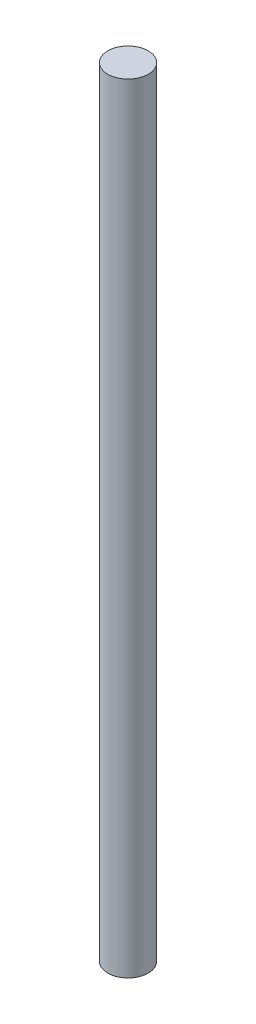
ISO-10303-21;
HEADER;
FILE_DESCRIPTION(('STEP AP214'),'2;1');
FILE_NAME('part.step','',(''),(''),'','','');
FILE_SCHEMA(('AUTOMOTIVE_DESIGN { 1 0 10303 214 1 1 1 1 }'));
ENDSEC;
DATA;
#1=APPLICATION_CONTEXT('core data for automotive mechanical design processes');
#2=APPLICATION_PROTOCOL_DEFINITION('international standard','automotive_design',2000,#1);
#3=PRODUCT_CONTEXT('',#1,'mechanical');
#4=PRODUCT('Part','Part','',(#3));
#5=PRODUCT_RELATED_PRODUCT_CATEGORY('part','',(#4));
#6=PRODUCT_DEFINITION_FORMATION('','',#4);
#7=PRODUCT_DEFINITION_CONTEXT('part definition',#1,'design');
#8=PRODUCT_DEFINITION('design','',#6,#7);
#9=PRODUCT_DEFINITION_SHAPE('','',#8);
#10=(LENGTH_UNIT() NAMED_UNIT(*) SI_UNIT(.MILLI.,.METRE.));
#11=(NAMED_UNIT(*) PLANE_ANGLE_UNIT() SI_UNIT($,.RADIAN.));
#12=(NAMED_UNIT(*) SI_UNIT($,.STERADIAN.) SOLID_ANGLE_UNIT());
#13=UNCERTAINTY_MEASURE_WITH_UNIT(LENGTH_MEASURE(1.E-05),#10,'distance_accuracy_value','');
#14=(GEOMETRIC_REPRESENTATION_CONTEXT(3) GLOBAL_UNCERTAINTY_ASSIGNED_CONTEXT((#13)) GLOBAL_UNIT_ASSIGNED_CONTEXT((#10,
#11,#12)) REPRESENTATION_CONTEXT('',''));
#15=CARTESIAN_POINT('',(0.,0.,0.));
#16=DIRECTION('',(0.,0.,1.));
#17=DIRECTION('',(1.,0.,0.));
#18=AXIS2_PLACEMENT_3D('',#15,#16,#17);
#19=CARTESIAN_POINT('',(0.,609.6,0.));
#20=DIRECTION('',(0.,-1.,0.));
#21=DIRECTION('',(0.,0.,-1.));
#22=AXIS2_PLACEMENT_3D('',#19,#20,#21);
#23=CYLINDRICAL_SURFACE('',#22,15.875);
#24=CARTESIAN_POINT('',(0.,609.6,0.));
#25=DIRECTION('',(0.,1.,0.));
#26=DIRECTION('',(0.,0.,1.));
#27=AXIS2_PLACEMENT_3D('',#24,#25,#26);
#28=CIRCLE('',#27,15.875);
#29=CARTESIAN_POINT('',(0.,609.6,-15.875));
#30=VERTEX_POINT('',#29);
#31=EDGE_CURVE('E10',#30,#30,#28,.T.);
#32=CARTESIAN_POINT('',(0.,0.,0.));
#33=DIRECTION('',(0.,1.,0.));
#34=DIRECTION('',(0.,0.,1.));
#35=AXIS2_PLACEMENT_3D('',#32,#33,#34);
#36=CIRCLE('',#35,15.875);
#37=CARTESIAN_POINT('',(0.,0.,-15.875));
#38=VERTEX_POINT('',#37);
#39=EDGE_CURVE('E40',#38,#38,#36,.T.);
#40=CARTESIAN_POINT('',(0.,609.6,-15.875));
#41=CARTESIAN_POINT('',(0.,603.25,-15.875));
#42=CARTESIAN_POINT('',(0.,596.9,-15.875));
#43=CARTESIAN_POINT('',(0.,584.2,-15.875));
#44=CARTESIAN_POINT('',(0.,577.85,-15.875));
#45=CARTESIAN_POINT('',(0.,565.15,-15.875));
#46=CARTESIAN_POINT('',(0.,558.8,-15.875));
#47=CARTESIAN_POINT('',(0.,546.1,-15.875));
#48=CARTESIAN_POINT('',(0.,539.75,-15.875));
#49=CARTESIAN_POINT('',(0.,527.05,-15.875));
#50=CARTESIAN_POINT('',(0.,520.7,-15.875));
#51=CARTESIAN_POINT('',(0.,508.,-15.875));
#52=CARTESIAN_POINT('',(0.,501.65,-15.875));
#53=CARTESIAN_POINT('',(0.,488.95,-15.875));
#54=CARTESIAN_POINT('',(0.,482.6,-15.875));
#55=CARTESIAN_POINT('',(0.,469.9,-15.875));
#56=CARTESIAN_POINT('',(0.,463.55,-15.875));
#57=CARTESIAN_POINT('',(0.,450.85,-15.875));
#58=CARTESIAN_POINT('',(0.,444.5,-15.875));
#59=CARTESIAN_POINT('',(0.,431.8,-15.875));
#60=CARTESIAN_POINT('',(0.,425.45,-15.875));
#61=CARTESIAN_POINT('',(0.,412.75,-15.875));
#62=CARTESIAN_POINT('',(0.,406.4,-15.875));
#63=CARTESIAN_POINT('',(0.,393.7,-15.875));
#64=CARTESIAN_POINT('',(0.,387.35,-15.875));
#65=CARTESIAN_POINT('',(0.,374.65,-15.875));
#66=CARTESIAN_POINT('',(0.,368.3,-15.875));
#67=CARTESIAN_POINT('',(0.,355.6,-15.875));
#68=CARTESIAN_POINT('',(0.,349.25,-15.875));
#69=CARTESIAN_POINT('',(0.,336.55,-15.875));
#70=CARTESIAN_POINT('',(0.,330.2,-15.875));
#71=CARTESIAN_POINT('',(0.,317.5,-15.875));
#72=CARTESIAN_POINT('',(0.,311.15,-15.875));
#73=CARTESIAN_POINT('',(0.,298.45,-15.875));
#74=CARTESIAN_POINT('',(0.,292.1,-15.875));
#75=CARTESIAN_POINT('',(0.,279.4,-15.875));
#76=CARTESIAN_POINT('',(0.,273.05,-15.875));
#77=CARTESIAN_POINT('',(0.,260.35,-15.875));
#78=CARTESIAN_POINT('',(0.,254.,-15.875));
#79=CARTESIAN_POINT('',(0.,241.3,-15.875));
#80=CARTESIAN_POINT('',(0.,234.95,-15.875));
#81=CARTESIAN_POINT('',(0.,222.25,-15.875));
#82=CARTESIAN_POINT('',(0.,215.9,-15.875));
#83=CARTESIAN_POINT('',(0.,203.2,-15.875));
#84=CARTESIAN_POINT('',(0.,196.85,-15.875));
#85=CARTESIAN_POINT('',(0.,184.15,-15.875));
#86=CARTESIAN_POINT('',(0.,177.8,-15.875));
#87=CARTESIAN_POINT('',(0.,165.1,-15.875));
#88=CARTESIAN_POINT('',(0.,158.75,-15.875));
#89=CARTESIAN_POINT('',(0.,146.05,-15.875));
#90=CARTESIAN_POINT('',(0.,139.7,-15.875));
#91=CARTESIAN_POINT('',(0.,127.,-15.875));
#92=CARTESIAN_POINT('',(0.,120.65,-15.875));
#93=CARTESIAN_POINT('',(0.,107.95,-15.875));
#94=CARTESIAN_POINT('',(0.,101.6,-15.875));
#95=CARTESIAN_POINT('',(0.,88.9,-15.875));
#96=CARTESIAN_POINT('',(0.,82.5500000000001,-15.875));
#97=CARTESIAN_POINT('',(0.,69.85,-15.875));
#98=CARTESIAN_POINT('',(0.,63.5,-15.875));
#99=CARTESIAN_POINT('',(0.,50.8,-15.875));
#100=CARTESIAN_POINT('',(0.,44.45,-15.875));
#101=CARTESIAN_POINT('',(0.,31.75,-15.875));
#102=CARTESIAN_POINT('',(0.,25.4,-15.875));
#103=CARTESIAN_POINT('',(0.,12.7,-15.875));
#104=CARTESIAN_POINT('',(0.,6.35000000000001,-15.875));
#105=CARTESIAN_POINT('',(0.,0.,-15.875));
#106=B_SPLINE_CURVE_WITH_KNOTS('',3,(#40,#41,#42,#43,#44,#45,#46,#47,#48,#49,#50,#51,#52,#53,
#54,#55,#56,#57,#58,#59,#60,#61,#62,#63,#64,#65,#66,#67,#68,#69,#70,#71,#72,#73,#74,#75,#76,#77,
#78,#79,#80,#81,#82,#83,#84,#85,#86,#87,#88,#89,#90,#91,#92,#93,#94,#95,#96,#97,#98,#99,#100,
#101,#102,#103,#104,#105),.UNSPECIFIED.,.F.,.F.,(4,2,2,2,2,2,2,2,2,2,2,2,2,2,2,2,2,2,2,2,2,2,2,
2,2,2,2,2,2,2,2,2,4),(0.,19.05,38.1,57.15,76.2,95.2500000000001,114.3,133.35,152.4,171.45,190.5,
209.55,228.6,247.65,266.7,285.75,304.8,323.85,342.9,361.95,381.,400.05,419.1,438.15,457.2,
476.25,495.3,514.35,533.4,552.45,571.5,590.55,609.6),.UNSPECIFIED.);
#107=EDGE_CURVE('BSEAM37',#30,#38,#106,.T.);
#108=ORIENTED_EDGE('',*,*,#31,.F.);
#109=ORIENTED_EDGE('',*,*,#39,.T.);
#110=ORIENTED_EDGE('',*,*,#107,.T.);
#111=ORIENTED_EDGE('',*,*,#107,.F.);
#112=EDGE_LOOP('',(#108,#110,#109,#111));
#113=FACE_BOUND('',#112,.T.);
#114=ADVANCED_FACE('F37',(#113),#23,.T.);
#115=CARTESIAN_POINT('',(0.,609.6,0.));
#116=DIRECTION('',(0.,1.,0.));
#117=DIRECTION('',(0.,0.,1.));
#118=AXIS2_PLACEMENT_3D('',#115,#116,#117);
#119=PLANE('',#118);
#120=ORIENTED_EDGE('',*,*,#31,.T.);
#121=EDGE_LOOP('',(#120));
#122=FACE_BOUND('',#121,.T.);
#123=ADVANCED_FACE('F96',(#122),#119,.T.);
#124=CARTESIAN_POINT('',(0.,0.,0.));
#125=DIRECTION('',(0.,1.,0.));
#126=DIRECTION('',(0.,0.,1.));
#127=AXIS2_PLACEMENT_3D('',#124,#125,#126);
#128=PLANE('',#127);
#129=CARTESIAN_POINT('',(0.,0.,11.43));
#130=DIRECTION('',(0.,-1.,0.));
#131=DIRECTION('',(0.,0.,-1.));
#132=AXIS2_PLACEMENT_3D('',#129,#130,#131);
#133=CIRCLE('',#132,2.1971);
#134=CARTESIAN_POINT('',(0.,0.,9.2329));
#135=VERTEX_POINT('',#134);
#136=EDGE_CURVE('E75',#135,#135,#133,.T.);
#137=ORIENTED_EDGE('',*,*,#136,.F.);
#138=EDGE_LOOP('',(#137));
#139=FACE_BOUND('',#138,.T.);
#140=CARTESIAN_POINT('',(11.43,0.,0.));
#141=DIRECTION('',(0.,-1.,0.));
#142=DIRECTION('',(0.,0.,-1.));
#143=AXIS2_PLACEMENT_3D('',#140,#141,#142);
#144=CIRCLE('',#143,2.1971);
#145=CARTESIAN_POINT('',(11.43,0.,-2.1971));
#146=VERTEX_POINT('',#145);
#147=EDGE_CURVE('E67',#146,#146,#144,.T.);
#148=ORIENTED_EDGE('',*,*,#147,.F.);
#149=EDGE_LOOP('',(#148));
#150=FACE_BOUND('',#149,.T.);
#151=CARTESIAN_POINT('',(0.,0.,-11.43));
#152=DIRECTION('',(0.,-1.,0.));
#153=DIRECTION('',(0.,0.,-1.));
#154=AXIS2_PLACEMENT_3D('',#151,#152,#153);
#155=CIRCLE('',#154,2.1971);
#156=CARTESIAN_POINT('',(0.,0.,-13.6271));
#157=VERTEX_POINT('',#156);
#158=EDGE_CURVE('E59',#157,#157,#155,.T.);
#159=ORIENTED_EDGE('',*,*,#158,.F.);
#160=EDGE_LOOP('',(#159));
#161=FACE_BOUND('',#160,.T.);
#162=CARTESIAN_POINT('',(-11.43,0.,0.));
#163=DIRECTION('',(0.,-1.,0.));
#164=DIRECTION('',(0.,0.,-1.));
#165=AXIS2_PLACEMENT_3D('',#162,#163,#164);
#166=CIRCLE('',#165,2.1971);
#167=CARTESIAN_POINT('',(-11.43,0.,-2.1971));
#168=VERTEX_POINT('',#167);
#169=EDGE_CURVE('E51',#168,#168,#166,.T.);
#170=ORIENTED_EDGE('',*,*,#169,.F.);
#171=EDGE_LOOP('',(#170));
#172=FACE_BOUND('',#171,.T.);
#173=ORIENTED_EDGE('',*,*,#39,.F.);
#174=EDGE_LOOP('',(#173));
#175=FACE_BOUND('',#174,.T.);
#176=ADVANCED_FACE('F92',(#139,#150,#161,#172,#175),#128,.F.);
#177=CARTESIAN_POINT('',(-11.43,76.2,0.));
#178=DIRECTION('',(0.,-1.,0.));
#179=DIRECTION('',(0.,0.,-1.));
#180=AXIS2_PLACEMENT_3D('',#177,#178,#179);
#181=CYLINDRICAL_SURFACE('',#180,2.1971);
#182=CARTESIAN_POINT('',(-11.43,76.2,0.));
#183=DIRECTION('',(0.,-1.,0.));
#184=DIRECTION('',(0.,0.,-1.));
#185=AXIS2_PLACEMENT_3D('',#182,#183,#184);
#186=CIRCLE('',#185,2.1971);
#187=CARTESIAN_POINT('',(-11.43,76.2,-2.1971));
#188=VERTEX_POINT('',#187);
#189=EDGE_CURVE('E55',#188,#188,#186,.T.);
#190=CARTESIAN_POINT('',(-11.43,76.2,-2.1971));
#191=CARTESIAN_POINT('',(-11.43,75.40625,-2.1971));
#192=CARTESIAN_POINT('',(-11.43,74.6125,-2.1971));
#193=CARTESIAN_POINT('',(-11.43,73.025,-2.1971));
#194=CARTESIAN_POINT('',(-11.43,72.23125,-2.1971));
#195=CARTESIAN_POINT('',(-11.43,70.64375,-2.1971));
#196=CARTESIAN_POINT('',(-11.43,69.85,-2.1971));
#197=CARTESIAN_POINT('',(-11.43,68.2625,-2.1971));
#198=CARTESIAN_POINT('',(-11.43,67.46875,-2.1971));
#199=CARTESIAN_POINT('',(-11.43,65.88125,-2.1971));
#200=CARTESIAN_POINT('',(-11.43,65.0875,-2.1971));
#201=CARTESIAN_POINT('',(-11.43,63.5,-2.1971));
#202=CARTESIAN_POINT('',(-11.43,62.70625,-2.1971));
#203=CARTESIAN_POINT('',(-11.43,61.11875,-2.1971));
#204=CARTESIAN_POINT('',(-11.43,60.325,-2.1971));
#205=CARTESIAN_POINT('',(-11.43,58.7375,-2.1971));
#206=CARTESIAN_POINT('',(-11.43,57.94375,-2.1971));
#207=CARTESIAN_POINT('',(-11.43,56.35625,-2.1971));
#208=CARTESIAN_POINT('',(-11.43,55.5625,-2.1971));
#209=CARTESIAN_POINT('',(-11.43,53.975,-2.1971));
#210=CARTESIAN_POINT('',(-11.43,53.18125,-2.1971));
#211=CARTESIAN_POINT('',(-11.43,51.59375,-2.1971));
#212=CARTESIAN_POINT('',(-11.43,50.8,-2.1971));
#213=CARTESIAN_POINT('',(-11.43,49.2125,-2.1971));
#214=CARTESIAN_POINT('',(-11.43,48.41875,-2.1971));
#215=CARTESIAN_POINT('',(-11.43,46.83125,-2.1971));
#216=CARTESIAN_POINT('',(-11.43,46.0375,-2.1971));
#217=CARTESIAN_POINT('',(-11.43,44.45,-2.1971));
#218=CARTESIAN_POINT('',(-11.43,43.65625,-2.1971));
#219=CARTESIAN_POINT('',(-11.43,42.06875,-2.1971));
#220=CARTESIAN_POINT('',(-11.43,41.275,-2.1971));
#221=CARTESIAN_POINT('',(-11.43,39.6875,-2.1971));
#222=CARTESIAN_POINT('',(-11.43,38.89375,-2.1971));
#223=CARTESIAN_POINT('',(-11.43,37.30625,-2.1971));
#224=CARTESIAN_POINT('',(-11.43,36.5125,-2.1971));
#225=CARTESIAN_POINT('',(-11.43,34.925,-2.1971));
#226=CARTESIAN_POINT('',(-11.43,34.13125,-2.1971));
#227=CARTESIAN_POINT('',(-11.43,32.54375,-2.1971));
#228=CARTESIAN_POINT('',(-11.43,31.75,-2.1971));
#229=CARTESIAN_POINT('',(-11.43,30.1625,-2.1971));
#230=CARTESIAN_POINT('',(-11.43,29.36875,-2.1971));
#231=CARTESIAN_POINT('',(-11.43,27.78125,-2.1971));
#232=CARTESIAN_POINT('',(-11.43,26.9875,-2.1971));
#233=CARTESIAN_POINT('',(-11.43,25.4,-2.1971));
#234=CARTESIAN_POINT('',(-11.43,24.60625,-2.1971));
#235=CARTESIAN_POINT('',(-11.43,23.01875,-2.1971));
#236=CARTESIAN_POINT('',(-11.43,22.225,-2.1971));
#237=CARTESIAN_POINT('',(-11.43,20.6375,-2.1971));
#238=CARTESIAN_POINT('',(-11.43,19.84375,-2.1971));
#239=CARTESIAN_POINT('',(-11.43,18.25625,-2.1971));
#240=CARTESIAN_POINT('',(-11.43,17.4625,-2.1971));
#241=CARTESIAN_POINT('',(-11.43,15.875,-2.1971));
#242=CARTESIAN_POINT('',(-11.43,15.08125,-2.1971));
#243=CARTESIAN_POINT('',(-11.43,13.49375,-2.1971));
#244=CARTESIAN_POINT('',(-11.43,12.7,-2.1971));
#245=CARTESIAN_POINT('',(-11.43,11.1125,-2.1971));
#246=CARTESIAN_POINT('',(-11.43,10.31875,-2.1971));
#247=CARTESIAN_POINT('',(-11.43,8.73125,-2.1971));
#248=CARTESIAN_POINT('',(-11.43,7.93750000000001,-2.1971));
#249=CARTESIAN_POINT('',(-11.43,6.35,-2.1971));
#250=CARTESIAN_POINT('',(-11.43,5.55625,-2.1971));
#251=CARTESIAN_POINT('',(-11.43,3.96875,-2.1971));
#252=CARTESIAN_POINT('',(-11.43,3.175,-2.1971));
#253=CARTESIAN_POINT('',(-11.43,1.5875,-2.1971));
#254=CARTESIAN_POINT('',(-11.43,0.793750000000001,-2.1971));
#255=CARTESIAN_POINT('',(-11.43,0.,-2.1971));
#256=B_SPLINE_CURVE_WITH_KNOTS('',3,(#190,#191,#192,#193,#194,#195,#196,#197,#198,#199,#200,
#201,#202,#203,#204,#205,#206,#207,#208,#209,#210,#211,#212,#213,#214,#215,#216,#217,#218,#219,
#220,#221,#222,#223,#224,#225,#226,#227,#228,#229,#230,#231,#232,#233,#234,#235,#236,#237,#238,
#239,#240,#241,#242,#243,#244,#245,#246,#247,#248,#249,#250,#251,#252,#253,#254,#255),
.UNSPECIFIED.,.F.,.F.,(4,2,2,2,2,2,2,2,2,2,2,2,2,2,2,2,2,2,2,2,2,2,2,2,2,2,2,2,2,2,2,2,4),(0.,
2.38125,4.7625,7.14375,9.52500000000001,11.90625,14.2875,16.66875,19.05,21.43125,23.8125,
26.19375,28.575,30.95625,33.3375,35.71875,38.1,40.48125,42.8625,45.24375,47.625,50.00625,
52.3875,54.76875,57.15,59.53125,61.9125,64.29375,66.675,69.05625,71.4375,73.81875,76.2),.UNSPECIFIED.);
#257=EDGE_CURVE('BSEAM95',#188,#168,#256,.T.);
#258=ORIENTED_EDGE('',*,*,#189,.F.);
#259=ORIENTED_EDGE('',*,*,#169,.T.);
#260=ORIENTED_EDGE('',*,*,#257,.T.);
#261=ORIENTED_EDGE('',*,*,#257,.F.);
#262=EDGE_LOOP('',(#258,#260,#259,#261));
#263=FACE_BOUND('',#262,.T.);
#264=ADVANCED_FACE('F95',(#263),#181,.F.);
#265=CARTESIAN_POINT('',(-11.43,76.2,0.));
#266=DIRECTION('',(0.,-1.,0.));
#267=DIRECTION('',(0.,0.,-1.));
#268=AXIS2_PLACEMENT_3D('',#265,#266,#267);
#269=PLANE('',#268);
#270=ORIENTED_EDGE('',*,*,#189,.T.);
#271=EDGE_LOOP('',(#270));
#272=FACE_BOUND('',#271,.T.);
#273=ADVANCED_FACE('F116',(#272),#269,.T.);
#274=CARTESIAN_POINT('',(0.,76.2,-11.43));
#275=DIRECTION('',(0.,-1.,0.));
#276=DIRECTION('',(0.,0.,-1.));
#277=AXIS2_PLACEMENT_3D('',#274,#275,#276);
#278=CYLINDRICAL_SURFACE('',#277,2.1971);
#279=CARTESIAN_POINT('',(0.,76.2,-11.43));
#280=DIRECTION('',(0.,-1.,0.));
#281=DIRECTION('',(0.,0.,-1.));
#282=AXIS2_PLACEMENT_3D('',#279,#280,#281);
#283=CIRCLE('',#282,2.1971);
#284=CARTESIAN_POINT('',(0.,76.2,-13.6271));
#285=VERTEX_POINT('',#284);
#286=EDGE_CURVE('E63',#285,#285,#283,.T.);
#287=CARTESIAN_POINT('',(0.,76.2,-13.6271));
#288=CARTESIAN_POINT('',(0.,75.40625,-13.6271));
#289=CARTESIAN_POINT('',(0.,74.6125,-13.6271));
#290=CARTESIAN_POINT('',(0.,73.025,-13.6271));
#291=CARTESIAN_POINT('',(0.,72.23125,-13.6271));
#292=CARTESIAN_POINT('',(0.,70.64375,-13.6271));
#293=CARTESIAN_POINT('',(0.,69.85,-13.6271));
#294=CARTESIAN_POINT('',(0.,68.2625,-13.6271));
#295=CARTESIAN_POINT('',(0.,67.46875,-13.6271));
#296=CARTESIAN_POINT('',(0.,65.88125,-13.6271));
#297=CARTESIAN_POINT('',(0.,65.0875,-13.6271));
#298=CARTESIAN_POINT('',(0.,63.5,-13.6271));
#299=CARTESIAN_POINT('',(0.,62.70625,-13.6271));
#300=CARTESIAN_POINT('',(0.,61.11875,-13.6271));
#301=CARTESIAN_POINT('',(0.,60.325,-13.6271));
#302=CARTESIAN_POINT('',(0.,58.7375,-13.6271));
#303=CARTESIAN_POINT('',(0.,57.94375,-13.6271));
#304=CARTESIAN_POINT('',(0.,56.35625,-13.6271));
#305=CARTESIAN_POINT('',(0.,55.5625,-13.6271));
#306=CARTESIAN_POINT('',(0.,53.975,-13.6271));
#307=CARTESIAN_POINT('',(0.,53.18125,-13.6271));
#308=CARTESIAN_POINT('',(0.,51.59375,-13.6271));
#309=CARTESIAN_POINT('',(0.,50.8,-13.6271));
#310=CARTESIAN_POINT('',(0.,49.2125,-13.6271));
#311=CARTESIAN_POINT('',(0.,48.41875,-13.6271));
#312=CARTESIAN_POINT('',(0.,46.83125,-13.6271));
#313=CARTESIAN_POINT('',(0.,46.0375,-13.6271));
#314=CARTESIAN_POINT('',(0.,44.45,-13.6271));
#315=CARTESIAN_POINT('',(0.,43.65625,-13.6271));
#316=CARTESIAN_POINT('',(0.,42.06875,-13.6271));
#317=CARTESIAN_POINT('',(0.,41.275,-13.6271));
#318=CARTESIAN_POINT('',(0.,39.6875,-13.6271));
#319=CARTESIAN_POINT('',(0.,38.89375,-13.6271));
#320=CARTESIAN_POINT('',(0.,37.30625,-13.6271));
#321=CARTESIAN_POINT('',(0.,36.5125,-13.6271));
#322=CARTESIAN_POINT('',(0.,34.925,-13.6271));
#323=CARTESIAN_POINT('',(0.,34.13125,-13.6271));
#324=CARTESIAN_POINT('',(0.,32.54375,-13.6271));
#325=CARTESIAN_POINT('',(0.,31.75,-13.6271));
#326=CARTESIAN_POINT('',(0.,30.1625,-13.6271));
#327=CARTESIAN_POINT('',(0.,29.36875,-13.6271));
#328=CARTESIAN_POINT('',(0.,27.78125,-13.6271));
#329=CARTESIAN_POINT('',(0.,26.9875,-13.6271));
#330=CARTESIAN_POINT('',(0.,25.4,-13.6271));
#331=CARTESIAN_POINT('',(0.,24.60625,-13.6271));
#332=CARTESIAN_POINT('',(0.,23.01875,-13.6271));
#333=CARTESIAN_POINT('',(0.,22.225,-13.6271));
#334=CARTESIAN_POINT('',(0.,20.6375,-13.6271));
#335=CARTESIAN_POINT('',(0.,19.84375,-13.6271));
#336=CARTESIAN_POINT('',(0.,18.25625,-13.6271));
#337=CARTESIAN_POINT('',(0.,17.4625,-13.6271));
#338=CARTESIAN_POINT('',(0.,15.875,-13.6271));
#339=CARTESIAN_POINT('',(0.,15.08125,-13.6271));
#340=CARTESIAN_POINT('',(0.,13.49375,-13.6271));
#341=CARTESIAN_POINT('',(0.,12.7,-13.6271));
#342=CARTESIAN_POINT('',(0.,11.1125,-13.6271));
#343=CARTESIAN_POINT('',(0.,10.31875,-13.6271));
#344=CARTESIAN_POINT('',(0.,8.73125,-13.6271));
#345=CARTESIAN_POINT('',(0.,7.93750000000001,-13.6271));
#346=CARTESIAN_POINT('',(0.,6.35,-13.6271));
#347=CARTESIAN_POINT('',(0.,5.55625,-13.6271));
#348=CARTESIAN_POINT('',(0.,3.96875,-13.6271));
#349=CARTESIAN_POINT('',(0.,3.175,-13.6271));
#350=CARTESIAN_POINT('',(0.,1.5875,-13.6271));
#351=CARTESIAN_POINT('',(0.,0.793750000000001,-13.6271));
#352=CARTESIAN_POINT('',(0.,0.,-13.6271));
#353=B_SPLINE_CURVE_WITH_KNOTS('',3,(#287,#288,#289,#290,#291,#292,#293,#294,#295,#296,#297,
#298,#299,#300,#301,#302,#303,#304,#305,#306,#307,#308,#309,#310,#311,#312,#313,#314,#315,#316,
#317,#318,#319,#320,#321,#322,#323,#324,#325,#326,#327,#328,#329,#330,#331,#332,#333,#334,#335,
#336,#337,#338,#339,#340,#341,#342,#343,#344,#345,#346,#347,#348,#349,#350,#351,#352),
.UNSPECIFIED.,.F.,.F.,(4,2,2,2,2,2,2,2,2,2,2,2,2,2,2,2,2,2,2,2,2,2,2,2,2,2,2,2,2,2,2,2,4),(0.,
2.38125,4.7625,7.14375,9.52500000000001,11.90625,14.2875,16.66875,19.05,21.43125,23.8125,
26.19375,28.575,30.95625,33.3375,35.71875,38.1,40.48125,42.8625,45.24375,47.625,50.00625,
52.3875,54.76875,57.15,59.53125,61.9125,64.29375,66.675,69.05625,71.4375,73.81875,76.2),.UNSPECIFIED.);
#354=EDGE_CURVE('BSEAM120',#285,#157,#353,.T.);
#355=ORIENTED_EDGE('',*,*,#286,.F.);
#356=ORIENTED_EDGE('',*,*,#158,.T.);
#357=ORIENTED_EDGE('',*,*,#354,.T.);
#358=ORIENTED_EDGE('',*,*,#354,.F.);
#359=EDGE_LOOP('',(#355,#357,#356,#358));
#360=FACE_BOUND('',#359,.T.);
#361=ADVANCED_FACE('F120',(#360),#278,.F.);
#362=CARTESIAN_POINT('',(0.,76.2,-11.43));
#363=DIRECTION('',(0.,-1.,0.));
#364=DIRECTION('',(0.,0.,-1.));
#365=AXIS2_PLACEMENT_3D('',#362,#363,#364);
#366=PLANE('',#365);
#367=ORIENTED_EDGE('',*,*,#286,.T.);
#368=EDGE_LOOP('',(#367));
#369=FACE_BOUND('',#368,.T.);
#370=ADVANCED_FACE('F124',(#369),#366,.T.);
#371=CARTESIAN_POINT('',(11.43,76.2,0.));
#372=DIRECTION('',(0.,-1.,0.));
#373=DIRECTION('',(0.,0.,-1.));
#374=AXIS2_PLACEMENT_3D('',#371,#372,#373);
#375=CYLINDRICAL_SURFACE('',#374,2.1971);
#376=CARTESIAN_POINT('',(11.43,76.2,0.));
#377=DIRECTION('',(0.,-1.,0.));
#378=DIRECTION('',(0.,0.,-1.));
#379=AXIS2_PLACEMENT_3D('',#376,#377,#378);
#380=CIRCLE('',#379,2.1971);
#381=CARTESIAN_POINT('',(11.43,76.2,-2.1971));
#382=VERTEX_POINT('',#381);
#383=EDGE_CURVE('E71',#382,#382,#380,.T.);
#384=CARTESIAN_POINT('',(11.43,76.2,-2.1971));
#385=CARTESIAN_POINT('',(11.43,75.40625,-2.1971));
#386=CARTESIAN_POINT('',(11.43,74.6125,-2.1971));
#387=CARTESIAN_POINT('',(11.43,73.025,-2.1971));
#388=CARTESIAN_POINT('',(11.43,72.23125,-2.1971));
#389=CARTESIAN_POINT('',(11.43,70.64375,-2.1971));
#390=CARTESIAN_POINT('',(11.43,69.85,-2.1971));
#391=CARTESIAN_POINT('',(11.43,68.2625,-2.1971));
#392=CARTESIAN_POINT('',(11.43,67.46875,-2.1971));
#393=CARTESIAN_POINT('',(11.43,65.88125,-2.1971));
#394=CARTESIAN_POINT('',(11.43,65.0875,-2.1971));
#395=CARTESIAN_POINT('',(11.43,63.5,-2.1971));
#396=CARTESIAN_POINT('',(11.43,62.70625,-2.1971));
#397=CARTESIAN_POINT('',(11.43,61.11875,-2.1971));
#398=CARTESIAN_POINT('',(11.43,60.325,-2.1971));
#399=CARTESIAN_POINT('',(11.43,58.7375,-2.1971));
#400=CARTESIAN_POINT('',(11.43,57.94375,-2.1971));
#401=CARTESIAN_POINT('',(11.43,56.35625,-2.1971));
#402=CARTESIAN_POINT('',(11.43,55.5625,-2.1971));
#403=CARTESIAN_POINT('',(11.43,53.975,-2.1971));
#404=CARTESIAN_POINT('',(11.43,53.18125,-2.1971));
#405=CARTESIAN_POINT('',(11.43,51.59375,-2.1971));
#406=CARTESIAN_POINT('',(11.43,50.8,-2.1971));
#407=CARTESIAN_POINT('',(11.43,49.2125,-2.1971));
#408=CARTESIAN_POINT('',(11.43,48.41875,-2.1971));
#409=CARTESIAN_POINT('',(11.43,46.83125,-2.1971));
#410=CARTESIAN_POINT('',(11.43,46.0375,-2.1971));
#411=CARTESIAN_POINT('',(11.43,44.45,-2.1971));
#412=CARTESIAN_POINT('',(11.43,43.65625,-2.1971));
#413=CARTESIAN_POINT('',(11.43,42.06875,-2.1971));
#414=CARTESIAN_POINT('',(11.43,41.275,-2.1971));
#415=CARTESIAN_POINT('',(11.43,39.6875,-2.1971));
#416=CARTESIAN_POINT('',(11.43,38.89375,-2.1971));
#417=CARTESIAN_POINT('',(11.43,37.30625,-2.1971));
#418=CARTESIAN_POINT('',(11.43,36.5125,-2.1971));
#419=CARTESIAN_POINT('',(11.43,34.925,-2.1971));
#420=CARTESIAN_POINT('',(11.43,34.13125,-2.1971));
#421=CARTESIAN_POINT('',(11.43,32.54375,-2.1971));
#422=CARTESIAN_POINT('',(11.43,31.75,-2.1971));
#423=CARTESIAN_POINT('',(11.43,30.1625,-2.1971));
#424=CARTESIAN_POINT('',(11.43,29.36875,-2.1971));
#425=CARTESIAN_POINT('',(11.43,27.78125,-2.1971));
#426=CARTESIAN_POINT('',(11.43,26.9875,-2.1971));
#427=CARTESIAN_POINT('',(11.43,25.4,-2.1971));
#428=CARTESIAN_POINT('',(11.43,24.60625,-2.1971));
#429=CARTESIAN_POINT('',(11.43,23.01875,-2.1971));
#430=CARTESIAN_POINT('',(11.43,22.225,-2.1971));
#431=CARTESIAN_POINT('',(11.43,20.6375,-2.1971));
#432=CARTESIAN_POINT('',(11.43,19.84375,-2.1971));
#433=CARTESIAN_POINT('',(11.43,18.25625,-2.1971));
#434=CARTESIAN_POINT('',(11.43,17.4625,-2.1971));
#435=CARTESIAN_POINT('',(11.43,15.875,-2.1971));
#436=CARTESIAN_POINT('',(11.43,15.08125,-2.1971));
#437=CARTESIAN_POINT('',(11.43,13.49375,-2.1971));
#438=CARTESIAN_POINT('',(11.43,12.7,-2.1971));
#439=CARTESIAN_POINT('',(11.43,11.1125,-2.1971));
#440=CARTESIAN_POINT('',(11.43,10.31875,-2.1971));
#441=CARTESIAN_POINT('',(11.43,8.73125,-2.1971));
#442=CARTESIAN_POINT('',(11.43,7.93750000000001,-2.1971));
#443=CARTESIAN_POINT('',(11.43,6.35,-2.1971));
#444=CARTESIAN_POINT('',(11.43,5.55625,-2.1971));
#445=CARTESIAN_POINT('',(11.43,3.96875,-2.1971));
#446=CARTESIAN_POINT('',(11.43,3.175,-2.1971));
#447=CARTESIAN_POINT('',(11.43,1.5875,-2.1971));
#448=CARTESIAN_POINT('',(11.43,0.793750000000001,-2.1971));
#449=CARTESIAN_POINT('',(11.43,0.,-2.1971));
#450=B_SPLINE_CURVE_WITH_KNOTS('',3,(#384,#385,#386,#387,#388,#389,#390,#391,#392,#393,#394,
#395,#396,#397,#398,#399,#400,#401,#402,#403,#404,#405,#406,#407,#408,#409,#410,#411,#412,#413,
#414,#415,#416,#417,#418,#419,#420,#421,#422,#423,#424,#425,#426,#427,#428,#429,#430,#431,#432,
#433,#434,#435,#436,#437,#438,#439,#440,#441,#442,#443,#444,#445,#446,#447,#448,#449),
.UNSPECIFIED.,.F.,.F.,(4,2,2,2,2,2,2,2,2,2,2,2,2,2,2,2,2,2,2,2,2,2,2,2,2,2,2,2,2,2,2,2,4),(0.,
2.38125,4.7625,7.14375,9.52500000000001,11.90625,14.2875,16.66875,19.05,21.43125,23.8125,
26.19375,28.575,30.95625,33.3375,35.71875,38.1,40.48125,42.8625,45.24375,47.625,50.00625,
52.3875,54.76875,57.15,59.53125,61.9125,64.29375,66.675,69.05625,71.4375,73.81875,76.2),.UNSPECIFIED.);
#451=EDGE_CURVE('BSEAM128',#382,#146,#450,.T.);
#452=ORIENTED_EDGE('',*,*,#383,.F.);
#453=ORIENTED_EDGE('',*,*,#147,.T.);
#454=ORIENTED_EDGE('',*,*,#451,.T.);
#455=ORIENTED_EDGE('',*,*,#451,.F.);
#456=EDGE_LOOP('',(#452,#454,#453,#455));
#457=FACE_BOUND('',#456,.T.);
#458=ADVANCED_FACE('F128',(#457),#375,.F.);
#459=CARTESIAN_POINT('',(11.43,76.2,0.));
#460=DIRECTION('',(0.,-1.,0.));
#461=DIRECTION('',(0.,0.,-1.));
#462=AXIS2_PLACEMENT_3D('',#459,#460,#461);
#463=PLANE('',#462);
#464=ORIENTED_EDGE('',*,*,#383,.T.);
#465=EDGE_LOOP('',(#464));
#466=FACE_BOUND('',#465,.T.);
#467=ADVANCED_FACE('F88',(#466),#463,.T.);
#468=CARTESIAN_POINT('',(0.,76.2,11.43));
#469=DIRECTION('',(0.,-1.,0.));
#470=DIRECTION('',(0.,0.,-1.));
#471=AXIS2_PLACEMENT_3D('',#468,#469,#470);
#472=CYLINDRICAL_SURFACE('',#471,2.1971);
#473=CARTESIAN_POINT('',(0.,76.2,11.43));
#474=DIRECTION('',(0.,-1.,0.));
#475=DIRECTION('',(0.,0.,-1.));
#476=AXIS2_PLACEMENT_3D('',#473,#474,#475);
#477=CIRCLE('',#476,2.1971);
#478=CARTESIAN_POINT('',(0.,76.2,9.2329));
#479=VERTEX_POINT('',#478);
#480=EDGE_CURVE('E49',#479,#479,#477,.T.);
#481=CARTESIAN_POINT('',(0.,76.2,9.2329));
#482=CARTESIAN_POINT('',(0.,75.40625,9.2329));
#483=CARTESIAN_POINT('',(0.,74.6125,9.2329));
#484=CARTESIAN_POINT('',(0.,73.025,9.2329));
#485=CARTESIAN_POINT('',(0.,72.23125,9.2329));
#486=CARTESIAN_POINT('',(0.,70.64375,9.2329));
#487=CARTESIAN_POINT('',(0.,69.85,9.2329));
#488=CARTESIAN_POINT('',(0.,68.2625,9.2329));
#489=CARTESIAN_POINT('',(0.,67.46875,9.2329));
#490=CARTESIAN_POINT('',(0.,65.88125,9.2329));
#491=CARTESIAN_POINT('',(0.,65.0875,9.2329));
#492=CARTESIAN_POINT('',(0.,63.5,9.2329));
#493=CARTESIAN_POINT('',(0.,62.70625,9.2329));
#494=CARTESIAN_POINT('',(0.,61.11875,9.2329));
#495=CARTESIAN_POINT('',(0.,60.325,9.2329));
#496=CARTESIAN_POINT('',(0.,58.7375,9.2329));
#497=CARTESIAN_POINT('',(0.,57.94375,9.2329));
#498=CARTESIAN_POINT('',(0.,56.35625,9.2329));
#499=CARTESIAN_POINT('',(0.,55.5625,9.2329));
#500=CARTESIAN_POINT('',(0.,53.975,9.2329));
#501=CARTESIAN_POINT('',(0.,53.18125,9.2329));
#502=CARTESIAN_POINT('',(0.,51.59375,9.2329));
#503=CARTESIAN_POINT('',(0.,50.8,9.2329));
#504=CARTESIAN_POINT('',(0.,49.2125,9.2329));
#505=CARTESIAN_POINT('',(0.,48.41875,9.2329));
#506=CARTESIAN_POINT('',(0.,46.83125,9.2329));
#507=CARTESIAN_POINT('',(0.,46.0375,9.2329));
#508=CARTESIAN_POINT('',(0.,44.45,9.2329));
#509=CARTESIAN_POINT('',(0.,43.65625,9.2329));
#510=CARTESIAN_POINT('',(0.,42.06875,9.2329));
#511=CARTESIAN_POINT('',(0.,41.275,9.2329));
#512=CARTESIAN_POINT('',(0.,39.6875,9.2329));
#513=CARTESIAN_POINT('',(0.,38.89375,9.2329));
#514=CARTESIAN_POINT('',(0.,37.30625,9.2329));
#515=CARTESIAN_POINT('',(0.,36.5125,9.2329));
#516=CARTESIAN_POINT('',(0.,34.925,9.2329));
#517=CARTESIAN_POINT('',(0.,34.13125,9.2329));
#518=CARTESIAN_POINT('',(0.,32.54375,9.2329));
#519=CARTESIAN_POINT('',(0.,31.75,9.2329));
#520=CARTESIAN_POINT('',(0.,30.1625,9.2329));
#521=CARTESIAN_POINT('',(0.,29.36875,9.2329));
#522=CARTESIAN_POINT('',(0.,27.78125,9.2329));
#523=CARTESIAN_POINT('',(0.,26.9875,9.2329));
#524=CARTESIAN_POINT('',(0.,25.4,9.2329));
#525=CARTESIAN_POINT('',(0.,24.60625,9.2329));
#526=CARTESIAN_POINT('',(0.,23.01875,9.2329));
#527=CARTESIAN_POINT('',(0.,22.225,9.2329));
#528=CARTESIAN_POINT('',(0.,20.6375,9.2329));
#529=CARTESIAN_POINT('',(0.,19.84375,9.2329));
#530=CARTESIAN_POINT('',(0.,18.25625,9.2329));
#531=CARTESIAN_POINT('',(0.,17.4625,9.2329));
#532=CARTESIAN_POINT('',(0.,15.875,9.2329));
#533=CARTESIAN_POINT('',(0.,15.08125,9.2329));
#534=CARTESIAN_POINT('',(0.,13.49375,9.2329));
#535=CARTESIAN_POINT('',(0.,12.7,9.2329));
#536=CARTESIAN_POINT('',(0.,11.1125,9.2329));
#537=CARTESIAN_POINT('',(0.,10.31875,9.2329));
#538=CARTESIAN_POINT('',(0.,8.73125,9.2329));
#539=CARTESIAN_POINT('',(0.,7.93750000000001,9.2329));
#540=CARTESIAN_POINT('',(0.,6.35,9.2329));
#541=CARTESIAN_POINT('',(0.,5.55625,9.2329));
#542=CARTESIAN_POINT('',(0.,3.96875,9.2329));
#543=CARTESIAN_POINT('',(0.,3.175,9.2329));
#544=CARTESIAN_POINT('',(0.,1.5875,9.2329));
#545=CARTESIAN_POINT('',(0.,0.793750000000001,9.2329));
#546=CARTESIAN_POINT('',(0.,0.,9.2329));
#547=B_SPLINE_CURVE_WITH_KNOTS('',3,(#481,#482,#483,#484,#485,#486,#487,#488,#489,#490,#491,
#492,#493,#494,#495,#496,#497,#498,#499,#500,#501,#502,#503,#504,#505,#506,#507,#508,#509,#510,
#511,#512,#513,#514,#515,#516,#517,#518,#519,#520,#521,#522,#523,#524,#525,#526,#527,#528,#529,
#530,#531,#532,#533,#534,#535,#536,#537,#538,#539,#540,#541,#542,#543,#544,#545,#546),
.UNSPECIFIED.,.F.,.F.,(4,2,2,2,2,2,2,2,2,2,2,2,2,2,2,2,2,2,2,2,2,2,2,2,2,2,2,2,2,2,2,2,4),(0.,
2.38125,4.7625,7.14375,9.52500000000001,11.90625,14.2875,16.66875,19.05,21.43125,23.8125,
26.19375,28.575,30.95625,33.3375,35.71875,38.1,40.48125,42.8625,45.24375,47.625,50.00625,
52.3875,54.76875,57.15,59.53125,61.9125,64.29375,66.675,69.05625,71.4375,73.81875,76.2),.UNSPECIFIED.);
#548=EDGE_CURVE('BSEAM85',#479,#135,#547,.T.);
#549=ORIENTED_EDGE('',*,*,#480,.F.);
#550=ORIENTED_EDGE('',*,*,#136,.T.);
#551=ORIENTED_EDGE('',*,*,#548,.T.);
#552=ORIENTED_EDGE('',*,*,#548,.F.);
#553=EDGE_LOOP('',(#549,#551,#550,#552));
#554=FACE_BOUND('',#553,.T.);
#555=ADVANCED_FACE('F85',(#554),#472,.F.);
#556=CARTESIAN_POINT('',(0.,76.2,11.43));
#557=DIRECTION('',(0.,-1.,0.));
#558=DIRECTION('',(0.,0.,-1.));
#559=AXIS2_PLACEMENT_3D('',#556,#557,#558);
#560=PLANE('',#559);
#561=ORIENTED_EDGE('',*,*,#480,.T.);
#562=EDGE_LOOP('',(#561));
#563=FACE_BOUND('',#562,.T.);
#564=ADVANCED_FACE('F83',(#563),#560,.T.);
#565=CLOSED_SHELL('',(#114,#123,#176,#264,#273,#361,#370,#458,#467,#555,#564));
#566=MANIFOLD_SOLID_BREP('B2',#565);
#567=ADVANCED_BREP_SHAPE_REPRESENTATION('',(#18,#566),#14);
#568=SHAPE_DEFINITION_REPRESENTATION(#9,#567);
ENDSEC;
END-ISO-10303-21;
